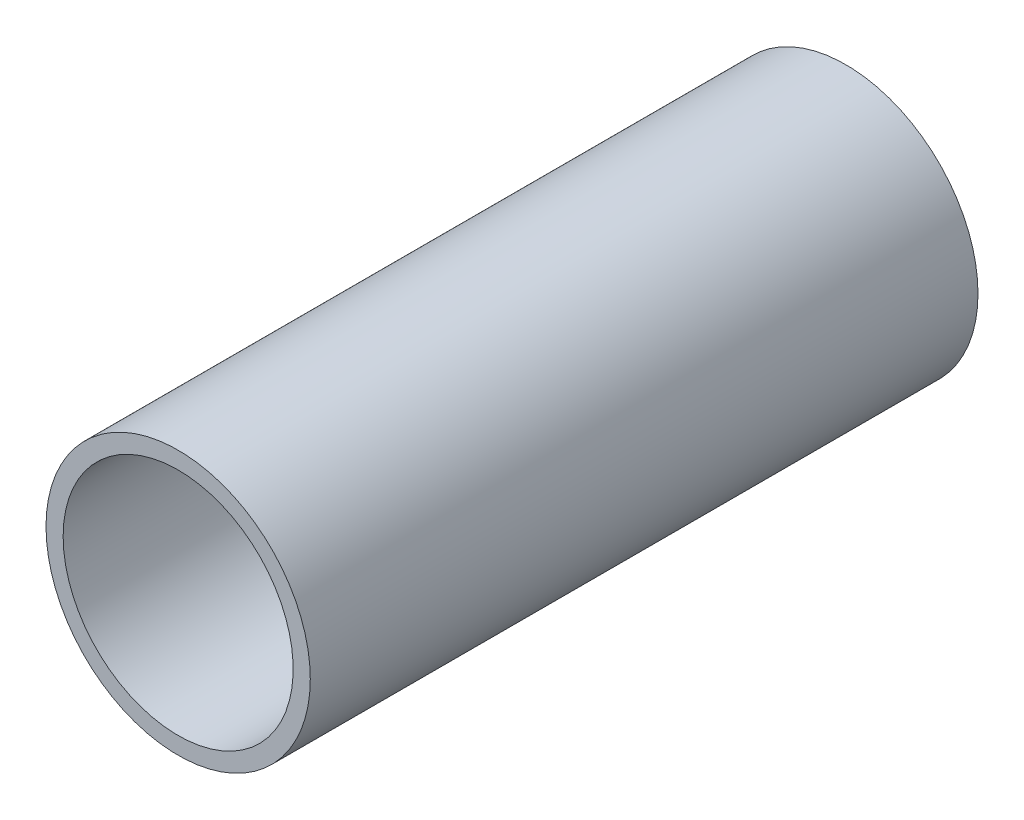
ISO-10303-21;
HEADER;
FILE_DESCRIPTION(('STEP AP214'),'2;1');
FILE_NAME('part.step','',(''),(''),'','','');
FILE_SCHEMA(('AUTOMOTIVE_DESIGN { 1 0 10303 214 1 1 1 1 }'));
ENDSEC;
DATA;
#1=APPLICATION_CONTEXT('core data for automotive mechanical design processes');
#2=APPLICATION_PROTOCOL_DEFINITION('international standard','automotive_design',2000,#1);
#3=PRODUCT_CONTEXT('',#1,'mechanical');
#4=PRODUCT('Part','Part','',(#3));
#5=PRODUCT_RELATED_PRODUCT_CATEGORY('part','',(#4));
#6=PRODUCT_DEFINITION_FORMATION('','',#4);
#7=PRODUCT_DEFINITION_CONTEXT('part definition',#1,'design');
#8=PRODUCT_DEFINITION('design','',#6,#7);
#9=PRODUCT_DEFINITION_SHAPE('','',#8);
#10=(LENGTH_UNIT() NAMED_UNIT(*) SI_UNIT(.MILLI.,.METRE.));
#11=(NAMED_UNIT(*) PLANE_ANGLE_UNIT() SI_UNIT($,.RADIAN.));
#12=(NAMED_UNIT(*) SI_UNIT($,.STERADIAN.) SOLID_ANGLE_UNIT());
#13=UNCERTAINTY_MEASURE_WITH_UNIT(LENGTH_MEASURE(1.E-05),#10,'distance_accuracy_value','');
#14=(GEOMETRIC_REPRESENTATION_CONTEXT(3) GLOBAL_UNCERTAINTY_ASSIGNED_CONTEXT((#13)) GLOBAL_UNIT_ASSIGNED_CONTEXT((#10,
#11,#12)) REPRESENTATION_CONTEXT('',''));
#15=CARTESIAN_POINT('',(0.,0.,0.));
#16=DIRECTION('',(0.,0.,1.));
#17=DIRECTION('',(1.,0.,0.));
#18=AXIS2_PLACEMENT_3D('',#15,#16,#17);
#19=CARTESIAN_POINT('',(0.,0.,152.4));
#20=DIRECTION('',(0.,0.,1.));
#21=DIRECTION('',(1.,0.,0.));
#22=AXIS2_PLACEMENT_3D('',#19,#20,#21);
#23=PLANE('',#22);
#24=CARTESIAN_POINT('',(0.,0.,152.4));
#25=DIRECTION('',(0.,0.,1.));
#26=DIRECTION('',(1.,0.,0.));
#27=AXIS2_PLACEMENT_3D('',#24,#25,#26);
#28=CIRCLE('',#27,30.1625);
#29=CARTESIAN_POINT('',(-30.1625,0.,152.4));
#30=VERTEX_POINT('',#29);
#31=EDGE_CURVE('E10',#30,#30,#28,.T.);
#32=ORIENTED_EDGE('',*,*,#31,.T.);
#33=EDGE_LOOP('',(#32));
#34=FACE_BOUND('',#33,.T.);
#35=CARTESIAN_POINT('',(0.,0.,152.4));
#36=DIRECTION('',(0.,0.,1.));
#37=DIRECTION('',(1.,0.,0.));
#38=AXIS2_PLACEMENT_3D('',#35,#36,#37);
#39=CIRCLE('',#38,26.2509);
#40=CARTESIAN_POINT('',(-26.2509,0.,152.4));
#41=VERTEX_POINT('',#40);
#42=EDGE_CURVE('E54',#41,#41,#39,.T.);
#43=ORIENTED_EDGE('',*,*,#42,.F.);
#44=EDGE_LOOP('',(#43));
#45=FACE_BOUND('',#44,.T.);
#46=ADVANCED_FACE('F41',(#34,#45),#23,.T.);
#47=CARTESIAN_POINT('',(0.,0.,0.));
#48=DIRECTION('',(0.,0.,1.));
#49=DIRECTION('',(1.,0.,0.));
#50=AXIS2_PLACEMENT_3D('',#47,#48,#49);
#51=PLANE('',#50);
#52=CARTESIAN_POINT('',(0.,0.,0.));
#53=DIRECTION('',(0.,0.,1.));
#54=DIRECTION('',(1.,0.,0.));
#55=AXIS2_PLACEMENT_3D('',#52,#53,#54);
#56=CIRCLE('',#55,30.1625);
#57=CARTESIAN_POINT('',(-30.1625,0.,0.));
#58=VERTEX_POINT('',#57);
#59=EDGE_CURVE('E45',#58,#58,#56,.T.);
#60=ORIENTED_EDGE('',*,*,#59,.F.);
#61=EDGE_LOOP('',(#60));
#62=FACE_BOUND('',#61,.T.);
#63=CARTESIAN_POINT('',(0.,0.,0.));
#64=DIRECTION('',(0.,0.,1.));
#65=DIRECTION('',(1.,0.,0.));
#66=AXIS2_PLACEMENT_3D('',#63,#64,#65);
#67=CIRCLE('',#66,26.2509);
#68=CARTESIAN_POINT('',(-26.2509,0.,0.));
#69=VERTEX_POINT('',#68);
#70=EDGE_CURVE('E56',#69,#69,#67,.T.);
#71=ORIENTED_EDGE('',*,*,#70,.T.);
#72=EDGE_LOOP('',(#71));
#73=FACE_BOUND('',#72,.T.);
#74=ADVANCED_FACE('F68',(#62,#73),#51,.F.);
#75=CARTESIAN_POINT('',(0.,0.,152.4));
#76=DIRECTION('',(0.,0.,-1.));
#77=DIRECTION('',(-1.,0.,0.));
#78=AXIS2_PLACEMENT_3D('',#75,#76,#77);
#79=CYLINDRICAL_SURFACE('',#78,30.1625);
#80=CARTESIAN_POINT('',(-30.1625,0.,152.4));
#81=CARTESIAN_POINT('',(-30.1625,0.,150.8125));
#82=CARTESIAN_POINT('',(-30.1625,0.,149.225));
#83=CARTESIAN_POINT('',(-30.1625,0.,146.05));
#84=CARTESIAN_POINT('',(-30.1625,0.,144.4625));
#85=CARTESIAN_POINT('',(-30.1625,0.,141.2875));
#86=CARTESIAN_POINT('',(-30.1625,0.,139.7));
#87=CARTESIAN_POINT('',(-30.1625,0.,136.525));
#88=CARTESIAN_POINT('',(-30.1625,0.,134.9375));
#89=CARTESIAN_POINT('',(-30.1625,0.,131.7625));
#90=CARTESIAN_POINT('',(-30.1625,0.,130.175));
#91=CARTESIAN_POINT('',(-30.1625,0.,127.));
#92=CARTESIAN_POINT('',(-30.1625,0.,125.4125));
#93=CARTESIAN_POINT('',(-30.1625,0.,122.2375));
#94=CARTESIAN_POINT('',(-30.1625,0.,120.65));
#95=CARTESIAN_POINT('',(-30.1625,0.,117.475));
#96=CARTESIAN_POINT('',(-30.1625,0.,115.8875));
#97=CARTESIAN_POINT('',(-30.1625,0.,112.7125));
#98=CARTESIAN_POINT('',(-30.1625,0.,111.125));
#99=CARTESIAN_POINT('',(-30.1625,0.,107.95));
#100=CARTESIAN_POINT('',(-30.1625,0.,106.3625));
#101=CARTESIAN_POINT('',(-30.1625,0.,103.1875));
#102=CARTESIAN_POINT('',(-30.1625,0.,101.6));
#103=CARTESIAN_POINT('',(-30.1625,0.,98.425));
#104=CARTESIAN_POINT('',(-30.1625,0.,96.8375));
#105=CARTESIAN_POINT('',(-30.1625,0.,93.6625));
#106=CARTESIAN_POINT('',(-30.1625,0.,92.075));
#107=CARTESIAN_POINT('',(-30.1625,0.,88.9));
#108=CARTESIAN_POINT('',(-30.1625,0.,87.3125));
#109=CARTESIAN_POINT('',(-30.1625,0.,84.1375));
#110=CARTESIAN_POINT('',(-30.1625,0.,82.55));
#111=CARTESIAN_POINT('',(-30.1625,0.,79.375));
#112=CARTESIAN_POINT('',(-30.1625,0.,77.7875));
#113=CARTESIAN_POINT('',(-30.1625,0.,74.6125));
#114=CARTESIAN_POINT('',(-30.1625,0.,73.025));
#115=CARTESIAN_POINT('',(-30.1625,0.,69.85));
#116=CARTESIAN_POINT('',(-30.1625,0.,68.2625));
#117=CARTESIAN_POINT('',(-30.1625,0.,65.0875));
#118=CARTESIAN_POINT('',(-30.1625,0.,63.5));
#119=CARTESIAN_POINT('',(-30.1625,0.,60.325));
#120=CARTESIAN_POINT('',(-30.1625,0.,58.7375));
#121=CARTESIAN_POINT('',(-30.1625,0.,55.5625));
#122=CARTESIAN_POINT('',(-30.1625,0.,53.975));
#123=CARTESIAN_POINT('',(-30.1625,0.,50.8));
#124=CARTESIAN_POINT('',(-30.1625,0.,49.2125));
#125=CARTESIAN_POINT('',(-30.1625,0.,46.0375));
#126=CARTESIAN_POINT('',(-30.1625,0.,44.45));
#127=CARTESIAN_POINT('',(-30.1625,0.,41.275));
#128=CARTESIAN_POINT('',(-30.1625,0.,39.6875));
#129=CARTESIAN_POINT('',(-30.1625,0.,36.5125));
#130=CARTESIAN_POINT('',(-30.1625,0.,34.925));
#131=CARTESIAN_POINT('',(-30.1625,0.,31.75));
#132=CARTESIAN_POINT('',(-30.1625,0.,30.1625));
#133=CARTESIAN_POINT('',(-30.1625,0.,26.9875));
#134=CARTESIAN_POINT('',(-30.1625,0.,25.4));
#135=CARTESIAN_POINT('',(-30.1625,0.,22.225));
#136=CARTESIAN_POINT('',(-30.1625,0.,20.6375));
#137=CARTESIAN_POINT('',(-30.1625,0.,17.4625));
#138=CARTESIAN_POINT('',(-30.1625,0.,15.875));
#139=CARTESIAN_POINT('',(-30.1625,0.,12.7));
#140=CARTESIAN_POINT('',(-30.1625,0.,11.1125));
#141=CARTESIAN_POINT('',(-30.1625,0.,7.93750000000001));
#142=CARTESIAN_POINT('',(-30.1625,0.,6.35));
#143=CARTESIAN_POINT('',(-30.1625,0.,3.175));
#144=CARTESIAN_POINT('',(-30.1625,0.,1.5875));
#145=CARTESIAN_POINT('',(-30.1625,0.,0.));
#146=B_SPLINE_CURVE_WITH_KNOTS('',3,(#80,#81,#82,#83,#84,#85,#86,#87,#88,#89,#90,#91,#92,#93,
#94,#95,#96,#97,#98,#99,#100,#101,#102,#103,#104,#105,#106,#107,#108,#109,#110,#111,#112,#113,
#114,#115,#116,#117,#118,#119,#120,#121,#122,#123,#124,#125,#126,#127,#128,#129,#130,#131,#132,
#133,#134,#135,#136,#137,#138,#139,#140,#141,#142,#143,#144,#145),.UNSPECIFIED.,.F.,.F.,(4,2,2,
2,2,2,2,2,2,2,2,2,2,2,2,2,2,2,2,2,2,2,2,2,2,2,2,2,2,2,2,2,4),(0.,4.76249999999998,
9.52499999999998,14.2875,19.05,23.8125,28.575,33.3375,38.1,42.8625,47.625,52.3875,57.15,61.9125,
66.675,71.4375,76.2,80.9625,85.725,90.4875,95.25,100.0125,104.775,109.5375,114.3,119.0625,
123.825,128.5875,133.35,138.1125,142.875,147.6375,152.4),.UNSPECIFIED.);
#147=EDGE_CURVE('BSEAM43',#30,#58,#146,.T.);
#148=ORIENTED_EDGE('',*,*,#31,.F.);
#149=ORIENTED_EDGE('',*,*,#59,.T.);
#150=ORIENTED_EDGE('',*,*,#147,.T.);
#151=ORIENTED_EDGE('',*,*,#147,.F.);
#152=EDGE_LOOP('',(#148,#150,#149,#151));
#153=FACE_BOUND('',#152,.T.);
#154=ADVANCED_FACE('F43',(#153),#79,.T.);
#155=CARTESIAN_POINT('',(0.,0.,152.4));
#156=DIRECTION('',(0.,0.,-1.));
#157=DIRECTION('',(-1.,0.,0.));
#158=AXIS2_PLACEMENT_3D('',#155,#156,#157);
#159=CYLINDRICAL_SURFACE('',#158,26.2509);
#160=CARTESIAN_POINT('',(-26.2509,0.,152.4));
#161=CARTESIAN_POINT('',(-26.2509,0.,150.8125));
#162=CARTESIAN_POINT('',(-26.2509,0.,149.225));
#163=CARTESIAN_POINT('',(-26.2509,0.,146.05));
#164=CARTESIAN_POINT('',(-26.2509,0.,144.4625));
#165=CARTESIAN_POINT('',(-26.2509,0.,141.2875));
#166=CARTESIAN_POINT('',(-26.2509,0.,139.7));
#167=CARTESIAN_POINT('',(-26.2509,0.,136.525));
#168=CARTESIAN_POINT('',(-26.2509,0.,134.9375));
#169=CARTESIAN_POINT('',(-26.2509,0.,131.7625));
#170=CARTESIAN_POINT('',(-26.2509,0.,130.175));
#171=CARTESIAN_POINT('',(-26.2509,0.,127.));
#172=CARTESIAN_POINT('',(-26.2509,0.,125.4125));
#173=CARTESIAN_POINT('',(-26.2509,0.,122.2375));
#174=CARTESIAN_POINT('',(-26.2509,0.,120.65));
#175=CARTESIAN_POINT('',(-26.2509,0.,117.475));
#176=CARTESIAN_POINT('',(-26.2509,0.,115.8875));
#177=CARTESIAN_POINT('',(-26.2509,0.,112.7125));
#178=CARTESIAN_POINT('',(-26.2509,0.,111.125));
#179=CARTESIAN_POINT('',(-26.2509,0.,107.95));
#180=CARTESIAN_POINT('',(-26.2509,0.,106.3625));
#181=CARTESIAN_POINT('',(-26.2509,0.,103.1875));
#182=CARTESIAN_POINT('',(-26.2509,0.,101.6));
#183=CARTESIAN_POINT('',(-26.2509,0.,98.425));
#184=CARTESIAN_POINT('',(-26.2509,0.,96.8375));
#185=CARTESIAN_POINT('',(-26.2509,0.,93.6625));
#186=CARTESIAN_POINT('',(-26.2509,0.,92.075));
#187=CARTESIAN_POINT('',(-26.2509,0.,88.9));
#188=CARTESIAN_POINT('',(-26.2509,0.,87.3125));
#189=CARTESIAN_POINT('',(-26.2509,0.,84.1375));
#190=CARTESIAN_POINT('',(-26.2509,0.,82.55));
#191=CARTESIAN_POINT('',(-26.2509,0.,79.375));
#192=CARTESIAN_POINT('',(-26.2509,0.,77.7875));
#193=CARTESIAN_POINT('',(-26.2509,0.,74.6125));
#194=CARTESIAN_POINT('',(-26.2509,0.,73.025));
#195=CARTESIAN_POINT('',(-26.2509,0.,69.85));
#196=CARTESIAN_POINT('',(-26.2509,0.,68.2625));
#197=CARTESIAN_POINT('',(-26.2509,0.,65.0875));
#198=CARTESIAN_POINT('',(-26.2509,0.,63.5));
#199=CARTESIAN_POINT('',(-26.2509,0.,60.325));
#200=CARTESIAN_POINT('',(-26.2509,0.,58.7375));
#201=CARTESIAN_POINT('',(-26.2509,0.,55.5625));
#202=CARTESIAN_POINT('',(-26.2509,0.,53.975));
#203=CARTESIAN_POINT('',(-26.2509,0.,50.8));
#204=CARTESIAN_POINT('',(-26.2509,0.,49.2125));
#205=CARTESIAN_POINT('',(-26.2509,0.,46.0375));
#206=CARTESIAN_POINT('',(-26.2509,0.,44.45));
#207=CARTESIAN_POINT('',(-26.2509,0.,41.275));
#208=CARTESIAN_POINT('',(-26.2509,0.,39.6875));
#209=CARTESIAN_POINT('',(-26.2509,0.,36.5125));
#210=CARTESIAN_POINT('',(-26.2509,0.,34.925));
#211=CARTESIAN_POINT('',(-26.2509,0.,31.75));
#212=CARTESIAN_POINT('',(-26.2509,0.,30.1625));
#213=CARTESIAN_POINT('',(-26.2509,0.,26.9875));
#214=CARTESIAN_POINT('',(-26.2509,0.,25.4));
#215=CARTESIAN_POINT('',(-26.2509,0.,22.225));
#216=CARTESIAN_POINT('',(-26.2509,0.,20.6375));
#217=CARTESIAN_POINT('',(-26.2509,0.,17.4625));
#218=CARTESIAN_POINT('',(-26.2509,0.,15.875));
#219=CARTESIAN_POINT('',(-26.2509,0.,12.7));
#220=CARTESIAN_POINT('',(-26.2509,0.,11.1125));
#221=CARTESIAN_POINT('',(-26.2509,0.,7.93750000000001));
#222=CARTESIAN_POINT('',(-26.2509,0.,6.35));
#223=CARTESIAN_POINT('',(-26.2509,0.,3.175));
#224=CARTESIAN_POINT('',(-26.2509,0.,1.5875));
#225=CARTESIAN_POINT('',(-26.2509,0.,0.));
#226=B_SPLINE_CURVE_WITH_KNOTS('',3,(#160,#161,#162,#163,#164,#165,#166,#167,#168,#169,#170,
#171,#172,#173,#174,#175,#176,#177,#178,#179,#180,#181,#182,#183,#184,#185,#186,#187,#188,#189,
#190,#191,#192,#193,#194,#195,#196,#197,#198,#199,#200,#201,#202,#203,#204,#205,#206,#207,#208,
#209,#210,#211,#212,#213,#214,#215,#216,#217,#218,#219,#220,#221,#222,#223,#224,#225),
.UNSPECIFIED.,.F.,.F.,(4,2,2,2,2,2,2,2,2,2,2,2,2,2,2,2,2,2,2,2,2,2,2,2,2,2,2,2,2,2,2,2,4),(0.,
4.76249999999998,9.52499999999998,14.2875,19.05,23.8125,28.575,33.3375,38.1,42.8625,47.625,
52.3875,57.15,61.9125,66.675,71.4375,76.2,80.9625,85.725,90.4875,95.25,100.0125,104.775,
109.5375,114.3,119.0625,123.825,128.5875,133.35,138.1125,142.875,147.6375,152.4),.UNSPECIFIED.);
#227=EDGE_CURVE('BSEAM64',#41,#69,#226,.T.);
#228=ORIENTED_EDGE('',*,*,#42,.T.);
#229=ORIENTED_EDGE('',*,*,#70,.F.);
#230=ORIENTED_EDGE('',*,*,#227,.T.);
#231=ORIENTED_EDGE('',*,*,#227,.F.);
#232=EDGE_LOOP('',(#228,#230,#229,#231));
#233=FACE_BOUND('',#232,.T.);
#234=ADVANCED_FACE('F64',(#233),#159,.F.);
#235=CLOSED_SHELL('',(#46,#74,#154,#234));
#236=MANIFOLD_SOLID_BREP('B2',#235);
#237=ADVANCED_BREP_SHAPE_REPRESENTATION('',(#18,#236),#14);
#238=SHAPE_DEFINITION_REPRESENTATION(#9,#237);
ENDSEC;
END-ISO-10303-21;
